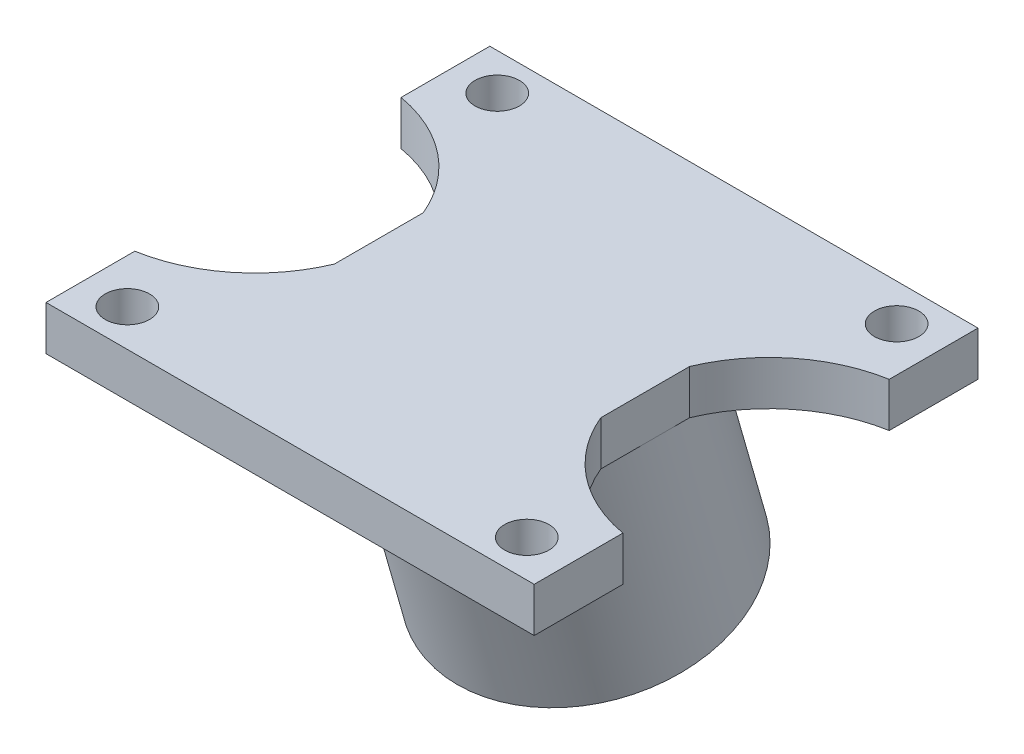
ISO-10303-21;
HEADER;
FILE_DESCRIPTION(('STEP AP214'),'2;1');
FILE_NAME('part.step','',(''),(''),'','','');
FILE_SCHEMA(('AUTOMOTIVE_DESIGN { 1 0 10303 214 1 1 1 1 }'));
ENDSEC;
DATA;
#1=APPLICATION_CONTEXT('core data for automotive mechanical design processes');
#2=APPLICATION_PROTOCOL_DEFINITION('international standard','automotive_design',2000,#1);
#3=PRODUCT_CONTEXT('',#1,'mechanical');
#4=PRODUCT('Part','Part','',(#3));
#5=PRODUCT_RELATED_PRODUCT_CATEGORY('part','',(#4));
#6=PRODUCT_DEFINITION_FORMATION('','',#4);
#7=PRODUCT_DEFINITION_CONTEXT('part definition',#1,'design');
#8=PRODUCT_DEFINITION('design','',#6,#7);
#9=PRODUCT_DEFINITION_SHAPE('','',#8);
#10=(LENGTH_UNIT() NAMED_UNIT(*) SI_UNIT(.MILLI.,.METRE.));
#11=(NAMED_UNIT(*) PLANE_ANGLE_UNIT() SI_UNIT($,.RADIAN.));
#12=(NAMED_UNIT(*) SI_UNIT($,.STERADIAN.) SOLID_ANGLE_UNIT());
#13=UNCERTAINTY_MEASURE_WITH_UNIT(LENGTH_MEASURE(1.E-05),#10,'distance_accuracy_value','');
#14=(GEOMETRIC_REPRESENTATION_CONTEXT(3) GLOBAL_UNCERTAINTY_ASSIGNED_CONTEXT((#13)) GLOBAL_UNIT_ASSIGNED_CONTEXT((#10,
#11,#12)) REPRESENTATION_CONTEXT('',''));
#15=CARTESIAN_POINT('',(0.,0.,0.));
#16=DIRECTION('',(0.,0.,1.));
#17=DIRECTION('',(1.,0.,0.));
#18=AXIS2_PLACEMENT_3D('',#15,#16,#17);
#19=CARTESIAN_POINT('',(-18.2294516371533,0.,-0.849314546441681));
#20=DIRECTION('',(0.,-1.,0.));
#21=DIRECTION('',(0.,0.,-1.));
#22=AXIS2_PLACEMENT_3D('',#19,#20,#21);
#23=PLANE('',#22);
#24=CARTESIAN_POINT('',(0.,0.,-0.860236157276425));
#25=DIRECTION('',(0.,-1.,0.));
#26=DIRECTION('',(0.,0.,1.));
#27=AXIS2_PLACEMENT_3D('',#24,#25,#26);
#28=ELLIPSE('',#27,9.36269492275442,9.);
#29=CARTESIAN_POINT('',(-9.,0.,-0.860236157276425));
#30=VERTEX_POINT('',#29);
#31=CARTESIAN_POINT('',(9.,0.,-0.860236157276425));
#32=VERTEX_POINT('',#31);
#33=EDGE_CURVE('E268',#30,#32,#28,.T.);
#34=ORIENTED_EDGE('',*,*,#33,.F.);
#35=DIRECTION('',(0.,0.,1.));
#36=VECTOR('',#35,1.);
#37=CARTESIAN_POINT('',(-9.,0.,-3.));
#38=LINE('',#37,#36);
#39=CARTESIAN_POINT('',(-9.,0.,-3.));
#40=VERTEX_POINT('',#39);
#41=EDGE_CURVE('E205',#40,#30,#38,.T.);
#42=ORIENTED_EDGE('',*,*,#41,.F.);
#43=CARTESIAN_POINT('',(-18.2294516371533,0.,0.849314546441679));
#44=DIRECTION('',(0.,-1.,0.));
#45=DIRECTION('',(0.,0.,1.));
#46=AXIS2_PLACEMENT_3D('',#43,#44,#45);
#47=CIRCLE('',#46,10.);
#48=CARTESIAN_POINT('',(-16.5,0.,-9.));
#49=VERTEX_POINT('',#48);
#50=EDGE_CURVE('E201',#49,#40,#47,.T.);
#51=ORIENTED_EDGE('',*,*,#50,.F.);
#52=DIRECTION('',(0.,0.,1.));
#53=VECTOR('',#52,1.);
#54=CARTESIAN_POINT('',(-16.5,0.,-15.));
#55=LINE('',#54,#53);
#56=CARTESIAN_POINT('',(-16.5,0.,-15.));
#57=VERTEX_POINT('',#56);
#58=EDGE_CURVE('E198',#57,#49,#55,.T.);
#59=ORIENTED_EDGE('',*,*,#58,.F.);
#60=DIRECTION('',(-1.,0.,0.));
#61=VECTOR('',#60,1.);
#62=CARTESIAN_POINT('',(-16.5,0.,-15.));
#63=LINE('',#62,#61);
#64=CARTESIAN_POINT('',(16.5,0.,-15.));
#65=VERTEX_POINT('',#64);
#66=EDGE_CURVE('E195',#65,#57,#63,.T.);
#67=ORIENTED_EDGE('',*,*,#66,.F.);
#68=DIRECTION('',(0.,0.,-1.));
#69=VECTOR('',#68,1.);
#70=CARTESIAN_POINT('',(16.5,0.,-15.));
#71=LINE('',#70,#69);
#72=CARTESIAN_POINT('',(16.5,0.,-9.));
#73=VERTEX_POINT('',#72);
#74=EDGE_CURVE('E192',#73,#65,#71,.T.);
#75=ORIENTED_EDGE('',*,*,#74,.F.);
#76=CARTESIAN_POINT('',(18.2294516371533,0.,0.849314546441676));
#77=DIRECTION('',(0.,-1.,0.));
#78=DIRECTION('',(0.,0.,-1.));
#79=AXIS2_PLACEMENT_3D('',#76,#77,#78);
#80=CIRCLE('',#79,10.);
#81=CARTESIAN_POINT('',(9.,0.,-3.));
#82=VERTEX_POINT('',#81);
#83=EDGE_CURVE('E189',#82,#73,#80,.T.);
#84=ORIENTED_EDGE('',*,*,#83,.F.);
#85=DIRECTION('',(0.,0.,-1.));
#86=VECTOR('',#85,1.);
#87=CARTESIAN_POINT('',(9.,0.,-3.));
#88=LINE('',#87,#86);
#89=EDGE_CURVE('E184',#32,#82,#88,.T.);
#90=ORIENTED_EDGE('',*,*,#89,.F.);
#91=EDGE_LOOP('',(#34,#42,#51,#59,#67,#75,#84,#90));
#92=FACE_BOUND('',#91,.T.);
#93=CARTESIAN_POINT('',(13.5,0.,-12.5));
#94=DIRECTION('',(0.,1.,0.));
#95=DIRECTION('',(0.,0.,1.));
#96=AXIS2_PLACEMENT_3D('',#93,#94,#95);
#97=CIRCLE('',#96,1.5);
#98=CARTESIAN_POINT('',(13.5,0.,-11.));
#99=VERTEX_POINT('',#98);
#100=EDGE_CURVE('E297',#99,#99,#97,.T.);
#101=ORIENTED_EDGE('',*,*,#100,.T.);
#102=EDGE_LOOP('',(#101));
#103=FACE_BOUND('',#102,.T.);
#104=CARTESIAN_POINT('',(-13.5,0.,-12.5));
#105=DIRECTION('',(0.,1.,0.));
#106=DIRECTION('',(0.,0.,1.));
#107=AXIS2_PLACEMENT_3D('',#104,#105,#106);
#108=CIRCLE('',#107,1.5);
#109=CARTESIAN_POINT('',(-13.5,0.,-11.));
#110=VERTEX_POINT('',#109);
#111=EDGE_CURVE('E305',#110,#110,#108,.T.);
#112=ORIENTED_EDGE('',*,*,#111,.T.);
#113=EDGE_LOOP('',(#112));
#114=FACE_BOUND('',#113,.T.);
#115=ADVANCED_FACE('F38',(#92,#103,#114),#23,.T.);
#116=CARTESIAN_POINT('',(-18.2294516371533,3.,-0.849314546441681));
#117=DIRECTION('',(0.,-1.,0.));
#118=DIRECTION('',(0.,0.,-1.));
#119=AXIS2_PLACEMENT_3D('',#116,#117,#118);
#120=PLANE('',#119);
#121=CARTESIAN_POINT('',(18.2294516371533,3.,-0.849314546441681));
#122=DIRECTION('',(0.,-1.,0.));
#123=DIRECTION('',(0.,0.,1.));
#124=AXIS2_PLACEMENT_3D('',#121,#122,#123);
#125=CIRCLE('',#124,10.);
#126=CARTESIAN_POINT('',(16.5,3.,8.99999999999999));
#127=VERTEX_POINT('',#126);
#128=CARTESIAN_POINT('',(9.,3.,3.));
#129=VERTEX_POINT('',#128);
#130=EDGE_CURVE('E117',#127,#129,#125,.T.);
#131=ORIENTED_EDGE('',*,*,#130,.T.);
#132=DIRECTION('',(0.,0.,-1.));
#133=VECTOR('',#132,1.);
#134=CARTESIAN_POINT('',(9.,3.,-3.));
#135=LINE('',#134,#133);
#136=CARTESIAN_POINT('',(9.,3.,-3.));
#137=VERTEX_POINT('',#136);
#138=EDGE_CURVE('E254',#129,#137,#135,.T.);
#139=ORIENTED_EDGE('',*,*,#138,.T.);
#140=CARTESIAN_POINT('',(18.2294516371533,3.,0.849314546441676));
#141=DIRECTION('',(0.,-1.,0.));
#142=DIRECTION('',(0.,0.,-1.));
#143=AXIS2_PLACEMENT_3D('',#140,#141,#142);
#144=CIRCLE('',#143,10.);
#145=CARTESIAN_POINT('',(16.5,3.,-9.));
#146=VERTEX_POINT('',#145);
#147=EDGE_CURVE('E321',#137,#146,#144,.T.);
#148=ORIENTED_EDGE('',*,*,#147,.T.);
#149=DIRECTION('',(0.,0.,-1.));
#150=VECTOR('',#149,1.);
#151=CARTESIAN_POINT('',(16.5,3.,-15.));
#152=LINE('',#151,#150);
#153=CARTESIAN_POINT('',(16.5,3.,-15.));
#154=VERTEX_POINT('',#153);
#155=EDGE_CURVE('E324',#146,#154,#152,.T.);
#156=ORIENTED_EDGE('',*,*,#155,.T.);
#157=DIRECTION('',(-1.,0.,0.));
#158=VECTOR('',#157,1.);
#159=CARTESIAN_POINT('',(-16.5,3.,-15.));
#160=LINE('',#159,#158);
#161=CARTESIAN_POINT('',(-16.5,3.,-15.));
#162=VERTEX_POINT('',#161);
#163=EDGE_CURVE('E327',#154,#162,#160,.T.);
#164=ORIENTED_EDGE('',*,*,#163,.T.);
#165=DIRECTION('',(0.,0.,1.));
#166=VECTOR('',#165,1.);
#167=CARTESIAN_POINT('',(-16.5,3.,-15.));
#168=LINE('',#167,#166);
#169=CARTESIAN_POINT('',(-16.5,3.,-9.));
#170=VERTEX_POINT('',#169);
#171=EDGE_CURVE('E330',#162,#170,#168,.T.);
#172=ORIENTED_EDGE('',*,*,#171,.T.);
#173=CARTESIAN_POINT('',(-18.2294516371533,3.,0.849314546441679));
#174=DIRECTION('',(0.,-1.,0.));
#175=DIRECTION('',(0.,0.,1.));
#176=AXIS2_PLACEMENT_3D('',#173,#174,#175);
#177=CIRCLE('',#176,10.);
#178=CARTESIAN_POINT('',(-9.,3.,-3.));
#179=VERTEX_POINT('',#178);
#180=EDGE_CURVE('E333',#170,#179,#177,.T.);
#181=ORIENTED_EDGE('',*,*,#180,.T.);
#182=DIRECTION('',(0.,0.,1.));
#183=VECTOR('',#182,1.);
#184=CARTESIAN_POINT('',(-9.,3.,-3.));
#185=LINE('',#184,#183);
#186=CARTESIAN_POINT('',(-9.,3.,3.));
#187=VERTEX_POINT('',#186);
#188=EDGE_CURVE('E151',#179,#187,#185,.T.);
#189=ORIENTED_EDGE('',*,*,#188,.T.);
#190=CARTESIAN_POINT('',(-18.2294516371533,3.,-0.849314546441681));
#191=DIRECTION('',(0.,-1.,0.));
#192=DIRECTION('',(0.,0.,-1.));
#193=AXIS2_PLACEMENT_3D('',#190,#191,#192);
#194=CIRCLE('',#193,10.);
#195=CARTESIAN_POINT('',(-16.5,3.,9.));
#196=VERTEX_POINT('',#195);
#197=EDGE_CURVE('E143',#187,#196,#194,.T.);
#198=ORIENTED_EDGE('',*,*,#197,.T.);
#199=DIRECTION('',(0.,0.,1.));
#200=VECTOR('',#199,1.);
#201=CARTESIAN_POINT('',(-16.5,3.,9.));
#202=LINE('',#201,#200);
#203=CARTESIAN_POINT('',(-16.5,3.,15.));
#204=VERTEX_POINT('',#203);
#205=EDGE_CURVE('E148',#196,#204,#202,.T.);
#206=ORIENTED_EDGE('',*,*,#205,.T.);
#207=DIRECTION('',(1.,0.,0.));
#208=VECTOR('',#207,1.);
#209=CARTESIAN_POINT('',(-16.5,3.,15.));
#210=LINE('',#209,#208);
#211=CARTESIAN_POINT('',(16.5,3.,15.));
#212=VERTEX_POINT('',#211);
#213=EDGE_CURVE('E64',#204,#212,#210,.T.);
#214=ORIENTED_EDGE('',*,*,#213,.T.);
#215=DIRECTION('',(0.,0.,-1.));
#216=VECTOR('',#215,1.);
#217=CARTESIAN_POINT('',(16.5,3.,9.));
#218=LINE('',#217,#216);
#219=EDGE_CURVE('E216',#212,#127,#218,.T.);
#220=ORIENTED_EDGE('',*,*,#219,.T.);
#221=EDGE_LOOP('',(#131,#139,#148,#156,#164,#172,#181,#189,#198,#206,#214,#220));
#222=FACE_BOUND('',#221,.T.);
#223=CARTESIAN_POINT('',(13.5,3.,12.5));
#224=DIRECTION('',(0.,1.,0.));
#225=DIRECTION('',(0.,0.,1.));
#226=AXIS2_PLACEMENT_3D('',#223,#224,#225);
#227=CIRCLE('',#226,1.5);
#228=CARTESIAN_POINT('',(13.5,3.,14.));
#229=VERTEX_POINT('',#228);
#230=EDGE_CURVE('E293',#229,#229,#227,.T.);
#231=ORIENTED_EDGE('',*,*,#230,.F.);
#232=EDGE_LOOP('',(#231));
#233=FACE_BOUND('',#232,.T.);
#234=CARTESIAN_POINT('',(-13.5,3.,12.5));
#235=DIRECTION('',(0.,1.,0.));
#236=DIRECTION('',(0.,0.,1.));
#237=AXIS2_PLACEMENT_3D('',#234,#235,#236);
#238=CIRCLE('',#237,1.5);
#239=CARTESIAN_POINT('',(-13.5,3.,14.));
#240=VERTEX_POINT('',#239);
#241=EDGE_CURVE('E284',#240,#240,#238,.T.);
#242=ORIENTED_EDGE('',*,*,#241,.F.);
#243=EDGE_LOOP('',(#242));
#244=FACE_BOUND('',#243,.T.);
#245=CARTESIAN_POINT('',(13.5,3.,-12.5));
#246=DIRECTION('',(0.,1.,0.));
#247=DIRECTION('',(0.,0.,1.));
#248=AXIS2_PLACEMENT_3D('',#245,#246,#247);
#249=CIRCLE('',#248,1.5);
#250=CARTESIAN_POINT('',(13.5,3.,-11.));
#251=VERTEX_POINT('',#250);
#252=EDGE_CURVE('E301',#251,#251,#249,.T.);
#253=ORIENTED_EDGE('',*,*,#252,.F.);
#254=EDGE_LOOP('',(#253));
#255=FACE_BOUND('',#254,.T.);
#256=CARTESIAN_POINT('',(-13.5,3.,-12.5));
#257=DIRECTION('',(0.,1.,0.));
#258=DIRECTION('',(0.,0.,1.));
#259=AXIS2_PLACEMENT_3D('',#256,#257,#258);
#260=CIRCLE('',#259,1.5);
#261=CARTESIAN_POINT('',(-13.5,3.,-11.));
#262=VERTEX_POINT('',#261);
#263=EDGE_CURVE('E181',#262,#262,#260,.T.);
#264=ORIENTED_EDGE('',*,*,#263,.F.);
#265=EDGE_LOOP('',(#264));
#266=FACE_BOUND('',#265,.T.);
#267=ADVANCED_FACE('F145',(#222,#233,#244,#255,#266),#120,.F.);
#268=EDGE_CURVE('E55',#32,#30,#28,.T.);
#269=ORIENTED_EDGE('',*,*,#268,.F.);
#270=CARTESIAN_POINT('',(9.,0.,3.));
#271=VERTEX_POINT('',#270);
#272=EDGE_CURVE('E185',#271,#32,#88,.T.);
#273=ORIENTED_EDGE('',*,*,#272,.F.);
#274=CARTESIAN_POINT('',(18.2294516371533,0.,-0.849314546441681));
#275=DIRECTION('',(0.,-1.,0.));
#276=DIRECTION('',(0.,0.,1.));
#277=AXIS2_PLACEMENT_3D('',#274,#275,#276);
#278=CIRCLE('',#277,10.);
#279=CARTESIAN_POINT('',(16.5,0.,8.99999999999999));
#280=VERTEX_POINT('',#279);
#281=EDGE_CURVE('E180',#280,#271,#278,.T.);
#282=ORIENTED_EDGE('',*,*,#281,.F.);
#283=DIRECTION('',(0.,0.,-1.));
#284=VECTOR('',#283,1.);
#285=CARTESIAN_POINT('',(16.5,0.,9.));
#286=LINE('',#285,#284);
#287=CARTESIAN_POINT('',(16.5,0.,15.));
#288=VERTEX_POINT('',#287);
#289=EDGE_CURVE('E176',#288,#280,#286,.T.);
#290=ORIENTED_EDGE('',*,*,#289,.F.);
#291=DIRECTION('',(1.,0.,0.));
#292=VECTOR('',#291,1.);
#293=CARTESIAN_POINT('',(-16.5,0.,15.));
#294=LINE('',#293,#292);
#295=CARTESIAN_POINT('',(-16.5,0.,15.));
#296=VERTEX_POINT('',#295);
#297=EDGE_CURVE('E109',#296,#288,#294,.T.);
#298=ORIENTED_EDGE('',*,*,#297,.F.);
#299=DIRECTION('',(0.,0.,1.));
#300=VECTOR('',#299,1.);
#301=CARTESIAN_POINT('',(-16.5,0.,9.));
#302=LINE('',#301,#300);
#303=CARTESIAN_POINT('',(-16.5,0.,9.));
#304=VERTEX_POINT('',#303);
#305=EDGE_CURVE('E211',#304,#296,#302,.T.);
#306=ORIENTED_EDGE('',*,*,#305,.F.);
#307=CARTESIAN_POINT('',(-18.2294516371533,0.,-0.849314546441681));
#308=DIRECTION('',(0.,-1.,0.));
#309=DIRECTION('',(0.,0.,-1.));
#310=AXIS2_PLACEMENT_3D('',#307,#308,#309);
#311=CIRCLE('',#310,10.);
#312=CARTESIAN_POINT('',(-9.,0.,3.));
#313=VERTEX_POINT('',#312);
#314=EDGE_CURVE('E161',#313,#304,#311,.T.);
#315=ORIENTED_EDGE('',*,*,#314,.F.);
#316=EDGE_CURVE('E204',#30,#313,#38,.T.);
#317=ORIENTED_EDGE('',*,*,#316,.F.);
#318=EDGE_LOOP('',(#269,#273,#282,#290,#298,#306,#315,#317));
#319=FACE_BOUND('',#318,.T.);
#320=CARTESIAN_POINT('',(13.5,0.,12.5));
#321=DIRECTION('',(0.,1.,0.));
#322=DIRECTION('',(0.,0.,1.));
#323=AXIS2_PLACEMENT_3D('',#320,#321,#322);
#324=CIRCLE('',#323,1.5);
#325=CARTESIAN_POINT('',(13.5,0.,14.));
#326=VERTEX_POINT('',#325);
#327=EDGE_CURVE('E288',#326,#326,#324,.T.);
#328=ORIENTED_EDGE('',*,*,#327,.T.);
#329=EDGE_LOOP('',(#328));
#330=FACE_BOUND('',#329,.T.);
#331=CARTESIAN_POINT('',(-13.5,0.,12.5));
#332=DIRECTION('',(0.,1.,0.));
#333=DIRECTION('',(0.,0.,1.));
#334=AXIS2_PLACEMENT_3D('',#331,#332,#333);
#335=CIRCLE('',#334,1.5);
#336=CARTESIAN_POINT('',(-13.5,0.,14.));
#337=VERTEX_POINT('',#336);
#338=EDGE_CURVE('E289',#337,#337,#335,.T.);
#339=ORIENTED_EDGE('',*,*,#338,.T.);
#340=EDGE_LOOP('',(#339));
#341=FACE_BOUND('',#340,.T.);
#342=ADVANCED_FACE('F255',(#319,#330,#341),#23,.T.);
#343=CARTESIAN_POINT('',(16.5,3.,9.));
#344=DIRECTION('',(-1.,0.,0.));
#345=DIRECTION('',(0.,0.,1.));
#346=AXIS2_PLACEMENT_3D('',#343,#344,#345);
#347=PLANE('',#346);
#348=ORIENTED_EDGE('',*,*,#289,.T.);
#349=DIRECTION('',(0.,-1.,0.));
#350=VECTOR('',#349,1.);
#351=CARTESIAN_POINT('',(16.5,3.,8.99999999999999));
#352=LINE('',#351,#350);
#353=EDGE_CURVE('E11',#127,#280,#352,.T.);
#354=ORIENTED_EDGE('',*,*,#353,.F.);
#355=ORIENTED_EDGE('',*,*,#219,.F.);
#356=DIRECTION('',(0.,-1.,0.));
#357=VECTOR('',#356,1.);
#358=CARTESIAN_POINT('',(16.5,3.,15.));
#359=LINE('',#358,#357);
#360=EDGE_CURVE('E172',#212,#288,#359,.T.);
#361=ORIENTED_EDGE('',*,*,#360,.T.);
#362=EDGE_LOOP('',(#348,#354,#355,#361));
#363=FACE_BOUND('',#362,.T.);
#364=ADVANCED_FACE('F40',(#363),#347,.F.);
#365=CARTESIAN_POINT('',(18.2294516371533,3.,-0.849314546441681));
#366=DIRECTION('',(0.,-1.,0.));
#367=DIRECTION('',(0.,0.,-1.));
#368=AXIS2_PLACEMENT_3D('',#365,#366,#367);
#369=CYLINDRICAL_SURFACE('',#368,10.);
#370=ORIENTED_EDGE('',*,*,#281,.T.);
#371=DIRECTION('',(0.,-1.,0.));
#372=VECTOR('',#371,1.);
#373=CARTESIAN_POINT('',(9.,3.,3.));
#374=LINE('',#373,#372);
#375=EDGE_CURVE('E48',#129,#271,#374,.T.);
#376=ORIENTED_EDGE('',*,*,#375,.F.);
#377=ORIENTED_EDGE('',*,*,#130,.F.);
#378=ORIENTED_EDGE('',*,*,#353,.T.);
#379=EDGE_LOOP('',(#370,#376,#377,#378));
#380=FACE_BOUND('',#379,.T.);
#381=ADVANCED_FACE('F259',(#380),#369,.F.);
#382=CARTESIAN_POINT('',(9.,3.,-3.));
#383=DIRECTION('',(-1.,0.,0.));
#384=DIRECTION('',(0.,0.,1.));
#385=AXIS2_PLACEMENT_3D('',#382,#383,#384);
#386=PLANE('',#385);
#387=ORIENTED_EDGE('',*,*,#272,.T.);
#388=ORIENTED_EDGE('',*,*,#89,.T.);
#389=DIRECTION('',(0.,-1.,0.));
#390=VECTOR('',#389,1.);
#391=CARTESIAN_POINT('',(9.,3.,-3.));
#392=LINE('',#391,#390);
#393=EDGE_CURVE('E243',#137,#82,#392,.T.);
#394=ORIENTED_EDGE('',*,*,#393,.F.);
#395=ORIENTED_EDGE('',*,*,#138,.F.);
#396=ORIENTED_EDGE('',*,*,#375,.T.);
#397=EDGE_LOOP('',(#387,#388,#394,#395,#396));
#398=FACE_BOUND('',#397,.T.);
#399=ADVANCED_FACE('F251',(#398),#386,.F.);
#400=CARTESIAN_POINT('',(18.2294516371533,3.,0.849314546441676));
#401=DIRECTION('',(0.,-1.,0.));
#402=DIRECTION('',(0.,0.,-1.));
#403=AXIS2_PLACEMENT_3D('',#400,#401,#402);
#404=CYLINDRICAL_SURFACE('',#403,10.);
#405=ORIENTED_EDGE('',*,*,#83,.T.);
#406=DIRECTION('',(0.,-1.,0.));
#407=VECTOR('',#406,1.);
#408=CARTESIAN_POINT('',(16.5,3.,-9.));
#409=LINE('',#408,#407);
#410=EDGE_CURVE('E239',#146,#73,#409,.T.);
#411=ORIENTED_EDGE('',*,*,#410,.F.);
#412=ORIENTED_EDGE('',*,*,#147,.F.);
#413=ORIENTED_EDGE('',*,*,#393,.T.);
#414=EDGE_LOOP('',(#405,#411,#412,#413));
#415=FACE_BOUND('',#414,.T.);
#416=ADVANCED_FACE('F381',(#415),#404,.F.);
#417=CARTESIAN_POINT('',(16.5,3.,-15.));
#418=DIRECTION('',(-1.,0.,0.));
#419=DIRECTION('',(0.,0.,1.));
#420=AXIS2_PLACEMENT_3D('',#417,#418,#419);
#421=PLANE('',#420);
#422=ORIENTED_EDGE('',*,*,#74,.T.);
#423=DIRECTION('',(0.,-1.,0.));
#424=VECTOR('',#423,1.);
#425=CARTESIAN_POINT('',(16.5,3.,-15.));
#426=LINE('',#425,#424);
#427=EDGE_CURVE('E235',#154,#65,#426,.T.);
#428=ORIENTED_EDGE('',*,*,#427,.F.);
#429=ORIENTED_EDGE('',*,*,#155,.F.);
#430=ORIENTED_EDGE('',*,*,#410,.T.);
#431=EDGE_LOOP('',(#422,#428,#429,#430));
#432=FACE_BOUND('',#431,.T.);
#433=ADVANCED_FACE('F386',(#432),#421,.F.);
#434=CARTESIAN_POINT('',(-16.5,3.,-15.));
#435=DIRECTION('',(0.,0.,1.));
#436=DIRECTION('',(1.,0.,0.));
#437=AXIS2_PLACEMENT_3D('',#434,#435,#436);
#438=PLANE('',#437);
#439=ORIENTED_EDGE('',*,*,#66,.T.);
#440=DIRECTION('',(0.,-1.,0.));
#441=VECTOR('',#440,1.);
#442=CARTESIAN_POINT('',(-16.5,3.,-15.));
#443=LINE('',#442,#441);
#444=EDGE_CURVE('E231',#162,#57,#443,.T.);
#445=ORIENTED_EDGE('',*,*,#444,.F.);
#446=ORIENTED_EDGE('',*,*,#163,.F.);
#447=ORIENTED_EDGE('',*,*,#427,.T.);
#448=EDGE_LOOP('',(#439,#445,#446,#447));
#449=FACE_BOUND('',#448,.T.);
#450=ADVANCED_FACE('F390',(#449),#438,.F.);
#451=CARTESIAN_POINT('',(-16.5,3.,-15.));
#452=DIRECTION('',(1.,0.,0.));
#453=DIRECTION('',(0.,0.,-1.));
#454=AXIS2_PLACEMENT_3D('',#451,#452,#453);
#455=PLANE('',#454);
#456=ORIENTED_EDGE('',*,*,#58,.T.);
#457=DIRECTION('',(0.,-1.,0.));
#458=VECTOR('',#457,1.);
#459=CARTESIAN_POINT('',(-16.5,3.,-9.));
#460=LINE('',#459,#458);
#461=EDGE_CURVE('E227',#170,#49,#460,.T.);
#462=ORIENTED_EDGE('',*,*,#461,.F.);
#463=ORIENTED_EDGE('',*,*,#171,.F.);
#464=ORIENTED_EDGE('',*,*,#444,.T.);
#465=EDGE_LOOP('',(#456,#462,#463,#464));
#466=FACE_BOUND('',#465,.T.);
#467=ADVANCED_FACE('F394',(#466),#455,.F.);
#468=CARTESIAN_POINT('',(-18.2294516371533,3.,0.849314546441679));
#469=DIRECTION('',(0.,-1.,0.));
#470=DIRECTION('',(0.,0.,-1.));
#471=AXIS2_PLACEMENT_3D('',#468,#469,#470);
#472=CYLINDRICAL_SURFACE('',#471,10.);
#473=ORIENTED_EDGE('',*,*,#50,.T.);
#474=DIRECTION('',(0.,-1.,0.));
#475=VECTOR('',#474,1.);
#476=CARTESIAN_POINT('',(-9.,3.,-3.));
#477=LINE('',#476,#475);
#478=EDGE_CURVE('E223',#179,#40,#477,.T.);
#479=ORIENTED_EDGE('',*,*,#478,.F.);
#480=ORIENTED_EDGE('',*,*,#180,.F.);
#481=ORIENTED_EDGE('',*,*,#461,.T.);
#482=EDGE_LOOP('',(#473,#479,#480,#481));
#483=FACE_BOUND('',#482,.T.);
#484=ADVANCED_FACE('F398',(#483),#472,.F.);
#485=CARTESIAN_POINT('',(-9.,3.,-3.));
#486=DIRECTION('',(1.,0.,0.));
#487=DIRECTION('',(0.,0.,-1.));
#488=AXIS2_PLACEMENT_3D('',#485,#486,#487);
#489=PLANE('',#488);
#490=ORIENTED_EDGE('',*,*,#41,.T.);
#491=ORIENTED_EDGE('',*,*,#316,.T.);
#492=DIRECTION('',(0.,-1.,0.));
#493=VECTOR('',#492,1.);
#494=CARTESIAN_POINT('',(-9.,3.,3.));
#495=LINE('',#494,#493);
#496=EDGE_CURVE('E165',#187,#313,#495,.T.);
#497=ORIENTED_EDGE('',*,*,#496,.F.);
#498=ORIENTED_EDGE('',*,*,#188,.F.);
#499=ORIENTED_EDGE('',*,*,#478,.T.);
#500=EDGE_LOOP('',(#490,#491,#497,#498,#499));
#501=FACE_BOUND('',#500,.T.);
#502=ADVANCED_FACE('F402',(#501),#489,.F.);
#503=CARTESIAN_POINT('',(-18.2294516371533,3.,-0.849314546441681));
#504=DIRECTION('',(0.,-1.,0.));
#505=DIRECTION('',(0.,0.,-1.));
#506=AXIS2_PLACEMENT_3D('',#503,#504,#505);
#507=CYLINDRICAL_SURFACE('',#506,10.);
#508=ORIENTED_EDGE('',*,*,#314,.T.);
#509=DIRECTION('',(0.,-1.,0.));
#510=VECTOR('',#509,1.);
#511=CARTESIAN_POINT('',(-16.5,3.,9.));
#512=LINE('',#511,#510);
#513=EDGE_CURVE('E158',#196,#304,#512,.T.);
#514=ORIENTED_EDGE('',*,*,#513,.F.);
#515=ORIENTED_EDGE('',*,*,#197,.F.);
#516=ORIENTED_EDGE('',*,*,#496,.T.);
#517=EDGE_LOOP('',(#508,#514,#515,#516));
#518=FACE_BOUND('',#517,.T.);
#519=ADVANCED_FACE('F159',(#518),#507,.F.);
#520=CARTESIAN_POINT('',(-16.5,3.,9.));
#521=DIRECTION('',(1.,0.,0.));
#522=DIRECTION('',(0.,0.,-1.));
#523=AXIS2_PLACEMENT_3D('',#520,#521,#522);
#524=PLANE('',#523);
#525=ORIENTED_EDGE('',*,*,#305,.T.);
#526=DIRECTION('',(0.,-1.,0.));
#527=VECTOR('',#526,1.);
#528=CARTESIAN_POINT('',(-16.5,3.,15.));
#529=LINE('',#528,#527);
#530=EDGE_CURVE('E166',#204,#296,#529,.T.);
#531=ORIENTED_EDGE('',*,*,#530,.F.);
#532=ORIENTED_EDGE('',*,*,#205,.F.);
#533=ORIENTED_EDGE('',*,*,#513,.T.);
#534=EDGE_LOOP('',(#525,#531,#532,#533));
#535=FACE_BOUND('',#534,.T.);
#536=ADVANCED_FACE('F168',(#535),#524,.F.);
#537=CARTESIAN_POINT('',(-16.5,3.,15.));
#538=DIRECTION('',(0.,0.,-1.));
#539=DIRECTION('',(-1.,0.,0.));
#540=AXIS2_PLACEMENT_3D('',#537,#538,#539);
#541=PLANE('',#540);
#542=ORIENTED_EDGE('',*,*,#297,.T.);
#543=ORIENTED_EDGE('',*,*,#360,.F.);
#544=ORIENTED_EDGE('',*,*,#213,.F.);
#545=ORIENTED_EDGE('',*,*,#530,.T.);
#546=EDGE_LOOP('',(#542,#543,#544,#545));
#547=FACE_BOUND('',#546,.T.);
#548=ADVANCED_FACE('F262',(#547),#541,.F.);
#549=CARTESIAN_POINT('',(-13.5,3.,-12.5));
#550=DIRECTION('',(0.,-1.,0.));
#551=DIRECTION('',(0.,0.,-1.));
#552=AXIS2_PLACEMENT_3D('',#549,#550,#551);
#553=CYLINDRICAL_SURFACE('',#552,1.5);
#554=ORIENTED_EDGE('',*,*,#263,.T.);
#555=EDGE_LOOP('',(#554));
#556=FACE_BOUND('',#555,.T.);
#557=ORIENTED_EDGE('',*,*,#111,.F.);
#558=EDGE_LOOP('',(#557));
#559=FACE_BOUND('',#558,.T.);
#560=ADVANCED_FACE('F410',(#556,#559),#553,.F.);
#561=CARTESIAN_POINT('',(13.5,3.,-12.5));
#562=DIRECTION('',(0.,-1.,0.));
#563=DIRECTION('',(0.,0.,-1.));
#564=AXIS2_PLACEMENT_3D('',#561,#562,#563);
#565=CYLINDRICAL_SURFACE('',#564,1.5);
#566=ORIENTED_EDGE('',*,*,#252,.T.);
#567=EDGE_LOOP('',(#566));
#568=FACE_BOUND('',#567,.T.);
#569=ORIENTED_EDGE('',*,*,#100,.F.);
#570=EDGE_LOOP('',(#569));
#571=FACE_BOUND('',#570,.T.);
#572=ADVANCED_FACE('F414',(#568,#571),#565,.F.);
#573=CARTESIAN_POINT('',(13.5,3.,12.5));
#574=DIRECTION('',(0.,-1.,0.));
#575=DIRECTION('',(0.,0.,-1.));
#576=AXIS2_PLACEMENT_3D('',#573,#574,#575);
#577=CYLINDRICAL_SURFACE('',#576,1.5);
#578=ORIENTED_EDGE('',*,*,#230,.T.);
#579=EDGE_LOOP('',(#578));
#580=FACE_BOUND('',#579,.T.);
#581=ORIENTED_EDGE('',*,*,#327,.F.);
#582=EDGE_LOOP('',(#581));
#583=FACE_BOUND('',#582,.T.);
#584=ADVANCED_FACE('F420',(#580,#583),#577,.F.);
#585=CARTESIAN_POINT('',(-13.5,3.,12.5));
#586=DIRECTION('',(0.,-1.,0.));
#587=DIRECTION('',(0.,0.,-1.));
#588=AXIS2_PLACEMENT_3D('',#585,#586,#587);
#589=CYLINDRICAL_SURFACE('',#588,1.5);
#590=ORIENTED_EDGE('',*,*,#241,.T.);
#591=EDGE_LOOP('',(#590));
#592=FACE_BOUND('',#591,.T.);
#593=ORIENTED_EDGE('',*,*,#338,.F.);
#594=EDGE_LOOP('',(#593));
#595=FACE_BOUND('',#594,.T.);
#596=ADVANCED_FACE('F347',(#592,#595),#589,.F.);
#597=CARTESIAN_POINT('',(0.,-14.3027105268897,-4.96147240470599));
#598=DIRECTION('',(0.,0.961261695938319,0.275637355817));
#599=DIRECTION('',(0.,-0.275637355817,0.961261695938319));
#600=AXIS2_PLACEMENT_3D('',#597,#598,#599);
#601=CYLINDRICAL_SURFACE('',#600,8.);
#602=CARTESIAN_POINT('',(0.,0.,-0.860236157276425));
#603=DIRECTION('',(0.,-1.,0.));
#604=DIRECTION('',(0.,0.,1.));
#605=AXIS2_PLACEMENT_3D('',#602,#603,#604);
#606=ELLIPSE('',#605,8.32239548689282,8.);
#607=CARTESIAN_POINT('',(0.,0.,7.46215932961639));
#608=VERTEX_POINT('',#607);
#609=EDGE_CURVE('E42',#608,#608,#606,.T.);
#610=ORIENTED_EDGE('',*,*,#609,.F.);
#611=EDGE_LOOP('',(#610));
#612=FACE_BOUND('',#611,.T.);
#613=CARTESIAN_POINT('',(0.,-14.3027105268897,-4.96147240470599));
#614=DIRECTION('',(0.,0.961261695938319,0.275637355817));
#615=DIRECTION('',(0.,-0.275637355817,0.961261695938319));
#616=AXIS2_PLACEMENT_3D('',#613,#614,#615);
#617=CIRCLE('',#616,8.);
#618=CARTESIAN_POINT('',(0.,-16.5078093734257,2.72862116280055));
#619=VERTEX_POINT('',#618);
#620=EDGE_CURVE('E280',#619,#619,#617,.T.);
#621=ORIENTED_EDGE('',*,*,#620,.F.);
#622=EDGE_LOOP('',(#621));
#623=FACE_BOUND('',#622,.T.);
#624=ADVANCED_FACE('F343',(#612,#623),#601,.F.);
#625=CARTESIAN_POINT('',(0.,-14.3027105268897,-4.96147240470599));
#626=DIRECTION('',(0.,0.961261695938319,0.275637355817));
#627=DIRECTION('',(0.,-0.275637355817,0.961261695938319));
#628=AXIS2_PLACEMENT_3D('',#625,#626,#627);
#629=PLANE('',#628);
#630=ORIENTED_EDGE('',*,*,#620,.T.);
#631=EDGE_LOOP('',(#630));
#632=FACE_BOUND('',#631,.T.);
#633=CARTESIAN_POINT('',(0.,-14.3027105268897,-4.96147240470599));
#634=DIRECTION('',(0.,0.961261695938319,0.275637355817));
#635=DIRECTION('',(0.,-0.275637355817,0.961261695938319));
#636=AXIS2_PLACEMENT_3D('',#633,#634,#635);
#637=CIRCLE('',#636,9.);
#638=CARTESIAN_POINT('',(0.,-16.7834467292427,3.68988285873887));
#639=VERTEX_POINT('',#638);
#640=EDGE_CURVE('E277',#639,#639,#637,.T.);
#641=ORIENTED_EDGE('',*,*,#640,.F.);
#642=EDGE_LOOP('',(#641));
#643=FACE_BOUND('',#642,.T.);
#644=ADVANCED_FACE('F346',(#632,#643),#629,.F.);
#645=CARTESIAN_POINT('',(0.,-14.3027105268897,-4.96147240470599));
#646=DIRECTION('',(0.,0.961261695938319,0.275637355817));
#647=DIRECTION('',(0.,-0.275637355817,0.961261695938319));
#648=AXIS2_PLACEMENT_3D('',#645,#646,#647);
#649=CYLINDRICAL_SURFACE('',#648,9.);
#650=ORIENTED_EDGE('',*,*,#640,.T.);
#651=EDGE_LOOP('',(#650));
#652=FACE_BOUND('',#651,.T.);
#653=ORIENTED_EDGE('',*,*,#268,.T.);
#654=ORIENTED_EDGE('',*,*,#33,.T.);
#655=EDGE_LOOP('',(#653,#654));
#656=FACE_BOUND('',#655,.T.);
#657=ADVANCED_FACE('F275',(#652,#656),#649,.T.);
#658=ORIENTED_EDGE('',*,*,#609,.T.);
#659=EDGE_LOOP('',(#658));
#660=FACE_BOUND('',#659,.T.);
#661=ADVANCED_FACE('F341',(#660),#23,.T.);
#662=CLOSED_SHELL('',(#115,#267,#342,#364,#381,#399,#416,#433,#450,#467,#484,#502,#519,#536,
#548,#560,#572,#584,#596,#624,#644,#657,#661));
#663=MANIFOLD_SOLID_BREP('B2',#662);
#664=ADVANCED_BREP_SHAPE_REPRESENTATION('',(#18,#663),#14);
#665=SHAPE_DEFINITION_REPRESENTATION(#9,#664);
ENDSEC;
END-ISO-10303-21;
